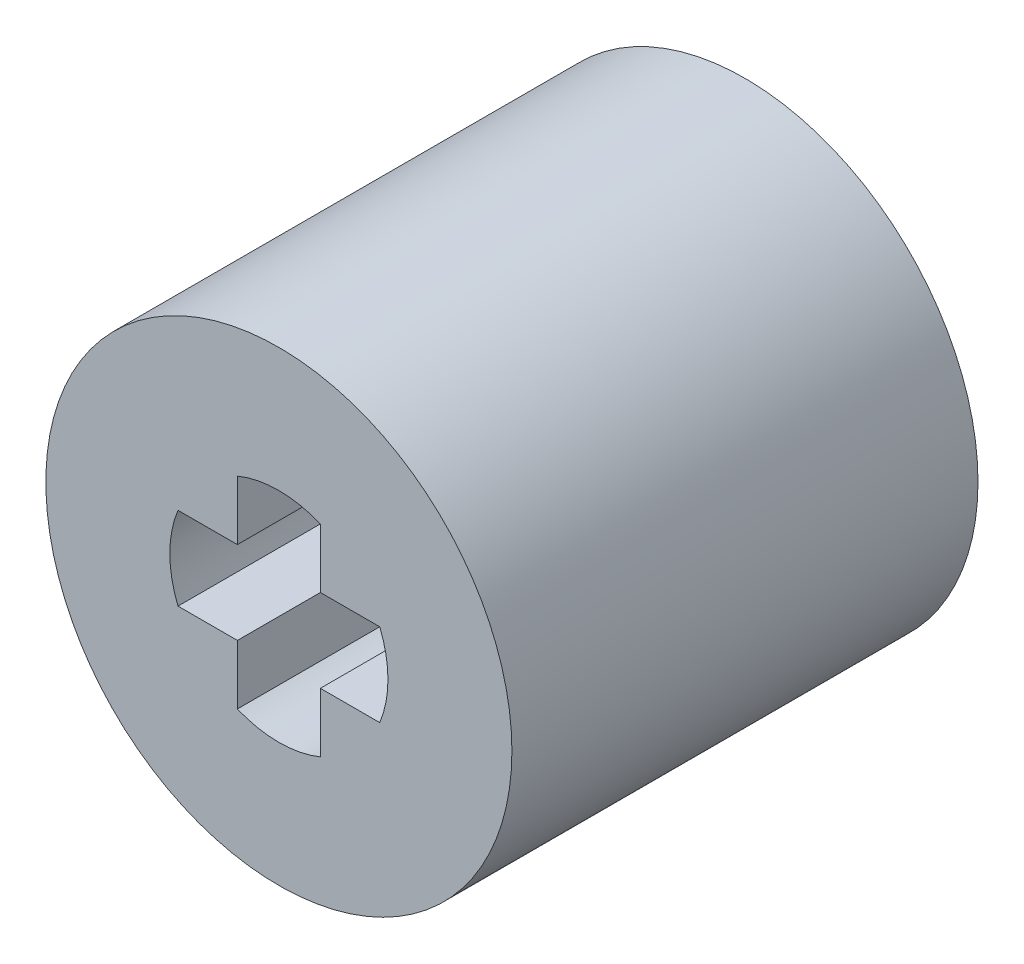
ISO-10303-21;
HEADER;
FILE_DESCRIPTION(('STEP AP214'),'2;1');
FILE_NAME('part.step','',(''),(''),'','','');
FILE_SCHEMA(('AUTOMOTIVE_DESIGN { 1 0 10303 214 1 1 1 1 }'));
ENDSEC;
DATA;
#1=APPLICATION_CONTEXT('core data for automotive mechanical design processes');
#2=APPLICATION_PROTOCOL_DEFINITION('international standard','automotive_design',2000,#1);
#3=PRODUCT_CONTEXT('',#1,'mechanical');
#4=PRODUCT('Part','Part','',(#3));
#5=PRODUCT_RELATED_PRODUCT_CATEGORY('part','',(#4));
#6=PRODUCT_DEFINITION_FORMATION('','',#4);
#7=PRODUCT_DEFINITION_CONTEXT('part definition',#1,'design');
#8=PRODUCT_DEFINITION('design','',#6,#7);
#9=PRODUCT_DEFINITION_SHAPE('','',#8);
#10=(LENGTH_UNIT() NAMED_UNIT(*) SI_UNIT(.MILLI.,.METRE.));
#11=(NAMED_UNIT(*) PLANE_ANGLE_UNIT() SI_UNIT($,.RADIAN.));
#12=(NAMED_UNIT(*) SI_UNIT($,.STERADIAN.) SOLID_ANGLE_UNIT());
#13=UNCERTAINTY_MEASURE_WITH_UNIT(LENGTH_MEASURE(1.E-05),#10,'distance_accuracy_value','');
#14=(GEOMETRIC_REPRESENTATION_CONTEXT(3) GLOBAL_UNCERTAINTY_ASSIGNED_CONTEXT((#13)) GLOBAL_UNIT_ASSIGNED_CONTEXT((#10,
#11,#12)) REPRESENTATION_CONTEXT('',''));
#15=CARTESIAN_POINT('',(0.,0.,0.));
#16=DIRECTION('',(0.,0.,1.));
#17=DIRECTION('',(1.,0.,0.));
#18=AXIS2_PLACEMENT_3D('',#15,#16,#17);
#19=CARTESIAN_POINT('',(0.,0.,0.));
#20=DIRECTION('',(0.,0.,1.));
#21=DIRECTION('',(1.,0.,0.));
#22=AXIS2_PLACEMENT_3D('',#19,#20,#21);
#23=PLANE('',#22);
#24=CARTESIAN_POINT('',(0.,0.,0.));
#25=DIRECTION('',(0.,0.,1.));
#26=DIRECTION('',(1.,0.,0.));
#27=AXIS2_PLACEMENT_3D('',#24,#25,#26);
#28=CIRCLE('',#27,1.5);
#29=CARTESIAN_POINT('',(-1.20743529847359,-0.89,0.));
#30=VERTEX_POINT('',#29);
#31=CARTESIAN_POINT('',(-0.889999999999999,-1.20743529847359,0.));
#32=VERTEX_POINT('',#31);
#33=EDGE_CURVE('E11',#30,#32,#28,.T.);
#34=ORIENTED_EDGE('',*,*,#33,.F.);
#35=DIRECTION('',(1.,0.,0.));
#36=VECTOR('',#35,1.);
#37=CARTESIAN_POINT('',(0.,-0.89,0.));
#38=LINE('',#37,#36);
#39=CARTESIAN_POINT('',(-0.89,-0.89,0.));
#40=VERTEX_POINT('',#39);
#41=EDGE_CURVE('E98',#30,#40,#38,.T.);
#42=ORIENTED_EDGE('',*,*,#41,.T.);
#43=DIRECTION('',(0.,-1.,0.));
#44=VECTOR('',#43,1.);
#45=CARTESIAN_POINT('',(-0.89,0.,0.));
#46=LINE('',#45,#44);
#47=EDGE_CURVE('E143',#40,#32,#46,.T.);
#48=ORIENTED_EDGE('',*,*,#47,.T.);
#49=EDGE_LOOP('',(#34,#42,#48));
#50=FACE_BOUND('',#49,.T.);
#51=ADVANCED_FACE('F47',(#50),#23,.F.);
#52=CARTESIAN_POINT('',(0.889999999999999,-1.20743529847359,0.));
#53=VERTEX_POINT('',#52);
#54=CARTESIAN_POINT('',(1.20743529847359,-0.89,0.));
#55=VERTEX_POINT('',#54);
#56=EDGE_CURVE('E57',#53,#55,#28,.T.);
#57=ORIENTED_EDGE('',*,*,#56,.F.);
#58=DIRECTION('',(0.,1.,0.));
#59=VECTOR('',#58,1.);
#60=CARTESIAN_POINT('',(0.89,0.,0.));
#61=LINE('',#60,#59);
#62=CARTESIAN_POINT('',(0.89,-0.89,0.));
#63=VERTEX_POINT('',#62);
#64=EDGE_CURVE('E205',#53,#63,#61,.T.);
#65=ORIENTED_EDGE('',*,*,#64,.T.);
#66=DIRECTION('',(1.,0.,0.));
#67=VECTOR('',#66,1.);
#68=CARTESIAN_POINT('',(0.,-0.89,0.));
#69=LINE('',#68,#67);
#70=EDGE_CURVE('E201',#63,#55,#69,.T.);
#71=ORIENTED_EDGE('',*,*,#70,.T.);
#72=EDGE_LOOP('',(#57,#65,#71));
#73=FACE_BOUND('',#72,.T.);
#74=ADVANCED_FACE('F313',(#73),#23,.F.);
#75=CARTESIAN_POINT('',(-1.11803398874989,1.,0.));
#76=VERTEX_POINT('',#75);
#77=CARTESIAN_POINT('',(-1.20743529847359,0.89,0.));
#78=VERTEX_POINT('',#77);
#79=EDGE_CURVE('E270',#76,#78,#28,.T.);
#80=ORIENTED_EDGE('',*,*,#79,.F.);
#81=DIRECTION('',(1.,0.,0.));
#82=VECTOR('',#81,1.);
#83=CARTESIAN_POINT('',(0.,1.,0.));
#84=LINE('',#83,#82);
#85=CARTESIAN_POINT('',(-0.89,1.,0.));
#86=VERTEX_POINT('',#85);
#87=EDGE_CURVE('E265',#76,#86,#84,.T.);
#88=ORIENTED_EDGE('',*,*,#87,.T.);
#89=DIRECTION('',(0.,-1.,0.));
#90=VECTOR('',#89,1.);
#91=CARTESIAN_POINT('',(-0.89,0.,0.));
#92=LINE('',#91,#90);
#93=CARTESIAN_POINT('',(-0.89,0.89,0.));
#94=VERTEX_POINT('',#93);
#95=EDGE_CURVE('E179',#86,#94,#92,.T.);
#96=ORIENTED_EDGE('',*,*,#95,.T.);
#97=DIRECTION('',(1.,0.,0.));
#98=VECTOR('',#97,1.);
#99=CARTESIAN_POINT('',(0.,0.89,0.));
#100=LINE('',#99,#98);
#101=EDGE_CURVE('E180',#78,#94,#100,.T.);
#102=ORIENTED_EDGE('',*,*,#101,.F.);
#103=EDGE_LOOP('',(#80,#88,#96,#102));
#104=FACE_BOUND('',#103,.T.);
#105=ADVANCED_FACE('F456',(#104),#23,.F.);
#106=CARTESIAN_POINT('',(1.20743529847359,0.89,0.));
#107=VERTEX_POINT('',#106);
#108=CARTESIAN_POINT('',(1.11803398874989,1.,0.));
#109=VERTEX_POINT('',#108);
#110=EDGE_CURVE('E263',#107,#109,#28,.T.);
#111=ORIENTED_EDGE('',*,*,#110,.F.);
#112=DIRECTION('',(1.,0.,0.));
#113=VECTOR('',#112,1.);
#114=CARTESIAN_POINT('',(0.,0.89,0.));
#115=LINE('',#114,#113);
#116=CARTESIAN_POINT('',(0.89,0.89,0.));
#117=VERTEX_POINT('',#116);
#118=EDGE_CURVE('E197',#117,#107,#115,.T.);
#119=ORIENTED_EDGE('',*,*,#118,.F.);
#120=DIRECTION('',(0.,1.,0.));
#121=VECTOR('',#120,1.);
#122=CARTESIAN_POINT('',(0.89,0.,0.));
#123=LINE('',#122,#121);
#124=CARTESIAN_POINT('',(0.89,1.,0.));
#125=VERTEX_POINT('',#124);
#126=EDGE_CURVE('E192',#117,#125,#123,.T.);
#127=ORIENTED_EDGE('',*,*,#126,.T.);
#128=EDGE_CURVE('E257',#125,#109,#84,.T.);
#129=ORIENTED_EDGE('',*,*,#128,.T.);
#130=EDGE_LOOP('',(#111,#119,#127,#129));
#131=FACE_BOUND('',#130,.T.);
#132=ADVANCED_FACE('F451',(#131),#23,.F.);
#133=CARTESIAN_POINT('',(0.,0.89,5.));
#134=DIRECTION('',(0.,1.,0.));
#135=DIRECTION('',(-1.,0.,0.));
#136=AXIS2_PLACEMENT_3D('',#133,#134,#135);
#137=PLANE('',#136);
#138=CARTESIAN_POINT('',(-2.16413955187737,0.89,0.));
#139=VERTEX_POINT('',#138);
#140=EDGE_CURVE('E175',#139,#78,#100,.T.);
#141=ORIENTED_EDGE('',*,*,#140,.T.);
#142=ORIENTED_EDGE('',*,*,#101,.T.);
#143=DIRECTION('',(0.,0.,-1.));
#144=VECTOR('',#143,1.);
#145=CARTESIAN_POINT('',(-0.89,0.89,5.));
#146=LINE('',#145,#144);
#147=CARTESIAN_POINT('',(-0.89,0.89,5.));
#148=VERTEX_POINT('',#147);
#149=EDGE_CURVE('E51',#148,#94,#146,.T.);
#150=ORIENTED_EDGE('',*,*,#149,.F.);
#151=DIRECTION('',(1.,0.,0.));
#152=VECTOR('',#151,1.);
#153=CARTESIAN_POINT('',(0.,0.89,5.));
#154=LINE('',#153,#152);
#155=CARTESIAN_POINT('',(-2.16413955187737,0.89,5.));
#156=VERTEX_POINT('',#155);
#157=EDGE_CURVE('E106',#156,#148,#154,.T.);
#158=ORIENTED_EDGE('',*,*,#157,.F.);
#159=DIRECTION('',(0.,0.,-1.));
#160=VECTOR('',#159,1.);
#161=CARTESIAN_POINT('',(-2.16413955187737,0.89,5.));
#162=LINE('',#161,#160);
#163=EDGE_CURVE('E75',#156,#139,#162,.T.);
#164=ORIENTED_EDGE('',*,*,#163,.T.);
#165=EDGE_LOOP('',(#141,#142,#150,#158,#164));
#166=FACE_BOUND('',#165,.T.);
#167=ADVANCED_FACE('F49',(#166),#137,.F.);
#168=CARTESIAN_POINT('',(-0.89,0.,5.));
#169=DIRECTION('',(1.,0.,0.));
#170=DIRECTION('',(0.,1.,0.));
#171=AXIS2_PLACEMENT_3D('',#168,#169,#170);
#172=PLANE('',#171);
#173=CARTESIAN_POINT('',(-0.89,2.16413955187737,0.));
#174=VERTEX_POINT('',#173);
#175=EDGE_CURVE('E181',#174,#86,#92,.T.);
#176=ORIENTED_EDGE('',*,*,#175,.F.);
#177=DIRECTION('',(0.,0.,-1.));
#178=VECTOR('',#177,1.);
#179=CARTESIAN_POINT('',(-0.89,2.16413955187737,5.));
#180=LINE('',#179,#178);
#181=CARTESIAN_POINT('',(-0.89,2.16413955187737,5.));
#182=VERTEX_POINT('',#181);
#183=EDGE_CURVE('E247',#182,#174,#180,.T.);
#184=ORIENTED_EDGE('',*,*,#183,.F.);
#185=DIRECTION('',(0.,-1.,0.));
#186=VECTOR('',#185,1.);
#187=CARTESIAN_POINT('',(-0.89,0.,5.));
#188=LINE('',#187,#186);
#189=EDGE_CURVE('E391',#182,#148,#188,.T.);
#190=ORIENTED_EDGE('',*,*,#189,.T.);
#191=ORIENTED_EDGE('',*,*,#149,.T.);
#192=ORIENTED_EDGE('',*,*,#95,.F.);
#193=EDGE_LOOP('',(#176,#184,#190,#191,#192));
#194=FACE_BOUND('',#193,.T.);
#195=ADVANCED_FACE('F418',(#194),#172,.T.);
#196=CARTESIAN_POINT('',(0.,0.,5.));
#197=DIRECTION('',(0.,0.,-1.));
#198=DIRECTION('',(-1.,0.,0.));
#199=AXIS2_PLACEMENT_3D('',#196,#197,#198);
#200=CYLINDRICAL_SURFACE('',#199,2.34);
#201=CARTESIAN_POINT('',(0.,0.,0.));
#202=DIRECTION('',(0.,0.,1.));
#203=DIRECTION('',(1.,0.,0.));
#204=AXIS2_PLACEMENT_3D('',#201,#202,#203);
#205=CIRCLE('',#204,2.34);
#206=CARTESIAN_POINT('',(0.89,2.16413955187737,0.));
#207=VERTEX_POINT('',#206);
#208=EDGE_CURVE('E185',#207,#174,#205,.T.);
#209=ORIENTED_EDGE('',*,*,#208,.F.);
#210=DIRECTION('',(0.,0.,-1.));
#211=VECTOR('',#210,1.);
#212=CARTESIAN_POINT('',(0.89,2.16413955187737,5.));
#213=LINE('',#212,#211);
#214=CARTESIAN_POINT('',(0.89,2.16413955187737,5.));
#215=VERTEX_POINT('',#214);
#216=EDGE_CURVE('E244',#215,#207,#213,.T.);
#217=ORIENTED_EDGE('',*,*,#216,.F.);
#218=CARTESIAN_POINT('',(0.,0.,5.));
#219=DIRECTION('',(0.,0.,1.));
#220=DIRECTION('',(1.,0.,0.));
#221=AXIS2_PLACEMENT_3D('',#218,#219,#220);
#222=CIRCLE('',#221,2.34);
#223=EDGE_CURVE('E169',#215,#182,#222,.T.);
#224=ORIENTED_EDGE('',*,*,#223,.T.);
#225=ORIENTED_EDGE('',*,*,#183,.T.);
#226=EDGE_LOOP('',(#209,#217,#224,#225));
#227=FACE_BOUND('',#226,.T.);
#228=ADVANCED_FACE('F421',(#227),#200,.F.);
#229=CARTESIAN_POINT('',(0.89,0.,5.));
#230=DIRECTION('',(-1.,0.,0.));
#231=DIRECTION('',(0.,-1.,0.));
#232=AXIS2_PLACEMENT_3D('',#229,#230,#231);
#233=PLANE('',#232);
#234=ORIENTED_EDGE('',*,*,#126,.F.);
#235=DIRECTION('',(0.,0.,-1.));
#236=VECTOR('',#235,1.);
#237=CARTESIAN_POINT('',(0.89,0.89,5.));
#238=LINE('',#237,#236);
#239=CARTESIAN_POINT('',(0.89,0.89,5.));
#240=VERTEX_POINT('',#239);
#241=EDGE_CURVE('E241',#240,#117,#238,.T.);
#242=ORIENTED_EDGE('',*,*,#241,.F.);
#243=DIRECTION('',(0.,1.,0.));
#244=VECTOR('',#243,1.);
#245=CARTESIAN_POINT('',(0.89,0.,5.));
#246=LINE('',#245,#244);
#247=EDGE_CURVE('E412',#240,#215,#246,.T.);
#248=ORIENTED_EDGE('',*,*,#247,.T.);
#249=ORIENTED_EDGE('',*,*,#216,.T.);
#250=EDGE_CURVE('E189',#125,#207,#123,.T.);
#251=ORIENTED_EDGE('',*,*,#250,.F.);
#252=EDGE_LOOP('',(#234,#242,#248,#249,#251));
#253=FACE_BOUND('',#252,.T.);
#254=ADVANCED_FACE('F424',(#253),#233,.T.);
#255=CARTESIAN_POINT('',(0.,0.89,5.));
#256=DIRECTION('',(0.,1.,0.));
#257=DIRECTION('',(-1.,0.,0.));
#258=AXIS2_PLACEMENT_3D('',#255,#256,#257);
#259=PLANE('',#258);
#260=ORIENTED_EDGE('',*,*,#118,.T.);
#261=CARTESIAN_POINT('',(2.16413955187737,0.89,0.));
#262=VERTEX_POINT('',#261);
#263=EDGE_CURVE('E196',#107,#262,#115,.T.);
#264=ORIENTED_EDGE('',*,*,#263,.T.);
#265=DIRECTION('',(0.,0.,-1.));
#266=VECTOR('',#265,1.);
#267=CARTESIAN_POINT('',(2.16413955187737,0.89,5.));
#268=LINE('',#267,#266);
#269=CARTESIAN_POINT('',(2.16413955187737,0.89,5.));
#270=VERTEX_POINT('',#269);
#271=EDGE_CURVE('E237',#270,#262,#268,.T.);
#272=ORIENTED_EDGE('',*,*,#271,.F.);
#273=DIRECTION('',(1.,0.,0.));
#274=VECTOR('',#273,1.);
#275=CARTESIAN_POINT('',(0.,0.89,5.));
#276=LINE('',#275,#274);
#277=EDGE_CURVE('E409',#240,#270,#276,.T.);
#278=ORIENTED_EDGE('',*,*,#277,.F.);
#279=ORIENTED_EDGE('',*,*,#241,.T.);
#280=EDGE_LOOP('',(#260,#264,#272,#278,#279));
#281=FACE_BOUND('',#280,.T.);
#282=ADVANCED_FACE('F429',(#281),#259,.F.);
#283=CARTESIAN_POINT('',(2.16413955187737,-0.89,0.));
#284=VERTEX_POINT('',#283);
#285=EDGE_CURVE('E191',#284,#262,#205,.T.);
#286=ORIENTED_EDGE('',*,*,#285,.F.);
#287=DIRECTION('',(0.,0.,-1.));
#288=VECTOR('',#287,1.);
#289=CARTESIAN_POINT('',(2.16413955187737,-0.89,5.));
#290=LINE('',#289,#288);
#291=CARTESIAN_POINT('',(2.16413955187737,-0.89,5.));
#292=VERTEX_POINT('',#291);
#293=EDGE_CURVE('E233',#292,#284,#290,.T.);
#294=ORIENTED_EDGE('',*,*,#293,.F.);
#295=EDGE_CURVE('E406',#292,#270,#222,.T.);
#296=ORIENTED_EDGE('',*,*,#295,.T.);
#297=ORIENTED_EDGE('',*,*,#271,.T.);
#298=EDGE_LOOP('',(#286,#294,#296,#297));
#299=FACE_BOUND('',#298,.T.);
#300=ADVANCED_FACE('F432',(#299),#200,.F.);
#301=CARTESIAN_POINT('',(0.,-0.89,5.));
#302=DIRECTION('',(0.,1.,0.));
#303=DIRECTION('',(-1.,0.,0.));
#304=AXIS2_PLACEMENT_3D('',#301,#302,#303);
#305=PLANE('',#304);
#306=ORIENTED_EDGE('',*,*,#70,.F.);
#307=DIRECTION('',(0.,0.,-1.));
#308=VECTOR('',#307,1.);
#309=CARTESIAN_POINT('',(0.89,-0.89,5.));
#310=LINE('',#309,#308);
#311=CARTESIAN_POINT('',(0.89,-0.89,5.));
#312=VERTEX_POINT('',#311);
#313=EDGE_CURVE('E229',#312,#63,#310,.T.);
#314=ORIENTED_EDGE('',*,*,#313,.F.);
#315=DIRECTION('',(1.,0.,0.));
#316=VECTOR('',#315,1.);
#317=CARTESIAN_POINT('',(0.,-0.89,5.));
#318=LINE('',#317,#316);
#319=EDGE_CURVE('E402',#312,#292,#318,.T.);
#320=ORIENTED_EDGE('',*,*,#319,.T.);
#321=ORIENTED_EDGE('',*,*,#293,.T.);
#322=EDGE_CURVE('E206',#55,#284,#69,.T.);
#323=ORIENTED_EDGE('',*,*,#322,.F.);
#324=EDGE_LOOP('',(#306,#314,#320,#321,#323));
#325=FACE_BOUND('',#324,.T.);
#326=ADVANCED_FACE('F435',(#325),#305,.T.);
#327=CARTESIAN_POINT('',(0.89,0.,5.));
#328=DIRECTION('',(-1.,0.,0.));
#329=DIRECTION('',(0.,-1.,0.));
#330=AXIS2_PLACEMENT_3D('',#327,#328,#329);
#331=PLANE('',#330);
#332=CARTESIAN_POINT('',(0.889999999999999,-2.16413955187737,0.));
#333=VERTEX_POINT('',#332);
#334=EDGE_CURVE('E207',#333,#53,#61,.T.);
#335=ORIENTED_EDGE('',*,*,#334,.F.);
#336=DIRECTION('',(0.,0.,-1.));
#337=VECTOR('',#336,1.);
#338=CARTESIAN_POINT('',(0.889999999999999,-2.16413955187737,5.));
#339=LINE('',#338,#337);
#340=CARTESIAN_POINT('',(0.889999999999999,-2.16413955187737,5.));
#341=VERTEX_POINT('',#340);
#342=EDGE_CURVE('E225',#341,#333,#339,.T.);
#343=ORIENTED_EDGE('',*,*,#342,.F.);
#344=DIRECTION('',(0.,1.,0.));
#345=VECTOR('',#344,1.);
#346=CARTESIAN_POINT('',(0.89,0.,5.));
#347=LINE('',#346,#345);
#348=EDGE_CURVE('E398',#341,#312,#347,.T.);
#349=ORIENTED_EDGE('',*,*,#348,.T.);
#350=ORIENTED_EDGE('',*,*,#313,.T.);
#351=ORIENTED_EDGE('',*,*,#64,.F.);
#352=EDGE_LOOP('',(#335,#343,#349,#350,#351));
#353=FACE_BOUND('',#352,.T.);
#354=ADVANCED_FACE('F318',(#353),#331,.T.);
#355=CARTESIAN_POINT('',(-0.889999999999999,-2.16413955187737,0.));
#356=VERTEX_POINT('',#355);
#357=EDGE_CURVE('E211',#356,#333,#205,.T.);
#358=ORIENTED_EDGE('',*,*,#357,.F.);
#359=DIRECTION('',(0.,0.,-1.));
#360=VECTOR('',#359,1.);
#361=CARTESIAN_POINT('',(-0.889999999999999,-2.16413955187737,5.));
#362=LINE('',#361,#360);
#363=CARTESIAN_POINT('',(-0.889999999999999,-2.16413955187737,5.));
#364=VERTEX_POINT('',#363);
#365=EDGE_CURVE('E147',#364,#356,#362,.T.);
#366=ORIENTED_EDGE('',*,*,#365,.F.);
#367=EDGE_CURVE('E157',#364,#341,#222,.T.);
#368=ORIENTED_EDGE('',*,*,#367,.T.);
#369=ORIENTED_EDGE('',*,*,#342,.T.);
#370=EDGE_LOOP('',(#358,#366,#368,#369));
#371=FACE_BOUND('',#370,.T.);
#372=ADVANCED_FACE('F397',(#371),#200,.F.);
#373=CARTESIAN_POINT('',(-0.89,0.,5.));
#374=DIRECTION('',(1.,0.,0.));
#375=DIRECTION('',(0.,1.,0.));
#376=AXIS2_PLACEMENT_3D('',#373,#374,#375);
#377=PLANE('',#376);
#378=ORIENTED_EDGE('',*,*,#47,.F.);
#379=DIRECTION('',(0.,0.,-1.));
#380=VECTOR('',#379,1.);
#381=CARTESIAN_POINT('',(-0.89,-0.89,5.));
#382=LINE('',#381,#380);
#383=CARTESIAN_POINT('',(-0.89,-0.89,5.));
#384=VERTEX_POINT('',#383);
#385=EDGE_CURVE('E137',#384,#40,#382,.T.);
#386=ORIENTED_EDGE('',*,*,#385,.F.);
#387=DIRECTION('',(0.,-1.,0.));
#388=VECTOR('',#387,1.);
#389=CARTESIAN_POINT('',(-0.89,0.,5.));
#390=LINE('',#389,#388);
#391=EDGE_CURVE('E141',#384,#364,#390,.T.);
#392=ORIENTED_EDGE('',*,*,#391,.T.);
#393=ORIENTED_EDGE('',*,*,#365,.T.);
#394=EDGE_CURVE('E214',#32,#356,#46,.T.);
#395=ORIENTED_EDGE('',*,*,#394,.F.);
#396=EDGE_LOOP('',(#378,#386,#392,#393,#395));
#397=FACE_BOUND('',#396,.T.);
#398=ADVANCED_FACE('F139',(#397),#377,.T.);
#399=CARTESIAN_POINT('',(0.,-0.89,5.));
#400=DIRECTION('',(0.,1.,0.));
#401=DIRECTION('',(-1.,0.,0.));
#402=AXIS2_PLACEMENT_3D('',#399,#400,#401);
#403=PLANE('',#402);
#404=CARTESIAN_POINT('',(-2.16413955187737,-0.89,0.));
#405=VERTEX_POINT('',#404);
#406=EDGE_CURVE('E215',#405,#30,#38,.T.);
#407=ORIENTED_EDGE('',*,*,#406,.F.);
#408=DIRECTION('',(0.,0.,-1.));
#409=VECTOR('',#408,1.);
#410=CARTESIAN_POINT('',(-2.16413955187737,-0.89,5.));
#411=LINE('',#410,#409);
#412=CARTESIAN_POINT('',(-2.16413955187737,-0.89,5.));
#413=VERTEX_POINT('',#412);
#414=EDGE_CURVE('E148',#413,#405,#411,.T.);
#415=ORIENTED_EDGE('',*,*,#414,.F.);
#416=DIRECTION('',(1.,0.,0.));
#417=VECTOR('',#416,1.);
#418=CARTESIAN_POINT('',(0.,-0.89,5.));
#419=LINE('',#418,#417);
#420=EDGE_CURVE('E154',#413,#384,#419,.T.);
#421=ORIENTED_EDGE('',*,*,#420,.T.);
#422=ORIENTED_EDGE('',*,*,#385,.T.);
#423=ORIENTED_EDGE('',*,*,#41,.F.);
#424=EDGE_LOOP('',(#407,#415,#421,#422,#423));
#425=FACE_BOUND('',#424,.T.);
#426=ADVANCED_FACE('F161',(#425),#403,.T.);
#427=EDGE_CURVE('E190',#139,#405,#205,.T.);
#428=ORIENTED_EDGE('',*,*,#427,.F.);
#429=ORIENTED_EDGE('',*,*,#163,.F.);
#430=EDGE_CURVE('E164',#156,#413,#222,.T.);
#431=ORIENTED_EDGE('',*,*,#430,.T.);
#432=ORIENTED_EDGE('',*,*,#414,.T.);
#433=EDGE_LOOP('',(#428,#429,#431,#432));
#434=FACE_BOUND('',#433,.T.);
#435=ADVANCED_FACE('F388',(#434),#200,.F.);
#436=CARTESIAN_POINT('',(0.,0.,5.));
#437=DIRECTION('',(0.,0.,-1.));
#438=DIRECTION('',(-1.,0.,0.));
#439=AXIS2_PLACEMENT_3D('',#436,#437,#438);
#440=CYLINDRICAL_SURFACE('',#439,5.);
#441=CARTESIAN_POINT('',(0.,0.,5.));
#442=DIRECTION('',(0.,0.,1.));
#443=DIRECTION('',(1.,0.,0.));
#444=AXIS2_PLACEMENT_3D('',#441,#442,#443);
#445=CIRCLE('',#444,5.);
#446=CARTESIAN_POINT('',(5.,0.,5.));
#447=VERTEX_POINT('',#446);
#448=EDGE_CURVE('E167',#447,#447,#445,.T.);
#449=ORIENTED_EDGE('',*,*,#448,.F.);
#450=EDGE_LOOP('',(#449));
#451=FACE_BOUND('',#450,.T.);
#452=CARTESIAN_POINT('',(0.,0.,-5.));
#453=DIRECTION('',(0.,0.,1.));
#454=DIRECTION('',(1.,0.,0.));
#455=AXIS2_PLACEMENT_3D('',#452,#453,#454);
#456=CIRCLE('',#455,5.);
#457=CARTESIAN_POINT('',(5.,0.,-5.));
#458=VERTEX_POINT('',#457);
#459=EDGE_CURVE('E337',#458,#458,#456,.T.);
#460=ORIENTED_EDGE('',*,*,#459,.T.);
#461=EDGE_LOOP('',(#460));
#462=FACE_BOUND('',#461,.T.);
#463=ADVANCED_FACE('F591',(#451,#462),#440,.T.);
#464=CARTESIAN_POINT('',(0.,0.,5.));
#465=DIRECTION('',(0.,0.,1.));
#466=DIRECTION('',(1.,0.,0.));
#467=AXIS2_PLACEMENT_3D('',#464,#465,#466);
#468=PLANE('',#467);
#469=ORIENTED_EDGE('',*,*,#157,.T.);
#470=ORIENTED_EDGE('',*,*,#189,.F.);
#471=ORIENTED_EDGE('',*,*,#223,.F.);
#472=ORIENTED_EDGE('',*,*,#247,.F.);
#473=ORIENTED_EDGE('',*,*,#277,.T.);
#474=ORIENTED_EDGE('',*,*,#295,.F.);
#475=ORIENTED_EDGE('',*,*,#319,.F.);
#476=ORIENTED_EDGE('',*,*,#348,.F.);
#477=ORIENTED_EDGE('',*,*,#367,.F.);
#478=ORIENTED_EDGE('',*,*,#391,.F.);
#479=ORIENTED_EDGE('',*,*,#420,.F.);
#480=ORIENTED_EDGE('',*,*,#430,.F.);
#481=EDGE_LOOP('',(#469,#470,#471,#472,#473,#474,#475,#476,#477,#478,#479,#480));
#482=FACE_BOUND('',#481,.T.);
#483=ORIENTED_EDGE('',*,*,#448,.T.);
#484=EDGE_LOOP('',(#483));
#485=FACE_BOUND('',#484,.T.);
#486=ADVANCED_FACE('F152',(#482,#485),#468,.T.);
#487=CARTESIAN_POINT('',(0.,0.,0.));
#488=DIRECTION('',(0.,0.,1.));
#489=DIRECTION('',(1.,0.,0.));
#490=AXIS2_PLACEMENT_3D('',#487,#488,#489);
#491=PLANE('',#490);
#492=ORIENTED_EDGE('',*,*,#140,.F.);
#493=ORIENTED_EDGE('',*,*,#427,.T.);
#494=ORIENTED_EDGE('',*,*,#406,.T.);
#495=EDGE_CURVE('E59',#78,#30,#28,.T.);
#496=ORIENTED_EDGE('',*,*,#495,.F.);
#497=EDGE_LOOP('',(#492,#493,#494,#496));
#498=FACE_BOUND('',#497,.T.);
#499=ADVANCED_FACE('F386',(#498),#491,.T.);
#500=EDGE_CURVE('E292',#32,#53,#28,.T.);
#501=ORIENTED_EDGE('',*,*,#500,.F.);
#502=ORIENTED_EDGE('',*,*,#394,.T.);
#503=ORIENTED_EDGE('',*,*,#357,.T.);
#504=ORIENTED_EDGE('',*,*,#334,.T.);
#505=EDGE_LOOP('',(#501,#502,#503,#504));
#506=FACE_BOUND('',#505,.T.);
#507=ADVANCED_FACE('F395',(#506),#491,.T.);
#508=EDGE_CURVE('E284',#55,#107,#28,.T.);
#509=ORIENTED_EDGE('',*,*,#508,.F.);
#510=ORIENTED_EDGE('',*,*,#322,.T.);
#511=ORIENTED_EDGE('',*,*,#285,.T.);
#512=ORIENTED_EDGE('',*,*,#263,.F.);
#513=EDGE_LOOP('',(#509,#510,#511,#512));
#514=FACE_BOUND('',#513,.T.);
#515=ADVANCED_FACE('F437',(#514),#491,.T.);
#516=CARTESIAN_POINT('',(0.,0.,-5.));
#517=DIRECTION('',(0.,0.,1.));
#518=DIRECTION('',(1.,0.,0.));
#519=AXIS2_PLACEMENT_3D('',#516,#517,#518);
#520=CYLINDRICAL_SURFACE('',#519,1.5);
#521=ORIENTED_EDGE('',*,*,#79,.T.);
#522=ORIENTED_EDGE('',*,*,#495,.T.);
#523=ORIENTED_EDGE('',*,*,#33,.T.);
#524=ORIENTED_EDGE('',*,*,#500,.T.);
#525=ORIENTED_EDGE('',*,*,#56,.T.);
#526=ORIENTED_EDGE('',*,*,#508,.T.);
#527=ORIENTED_EDGE('',*,*,#110,.T.);
#528=DIRECTION('',(0.,0.,1.));
#529=VECTOR('',#528,1.);
#530=CARTESIAN_POINT('',(1.11803398874989,1.,-5.));
#531=LINE('',#530,#529);
#532=CARTESIAN_POINT('',(1.11803398874989,1.,-5.));
#533=VERTEX_POINT('',#532);
#534=EDGE_CURVE('E66',#533,#109,#531,.T.);
#535=ORIENTED_EDGE('',*,*,#534,.F.);
#536=CARTESIAN_POINT('',(0.,0.,-5.));
#537=DIRECTION('',(0.,0.,1.));
#538=DIRECTION('',(1.,0.,0.));
#539=AXIS2_PLACEMENT_3D('',#536,#537,#538);
#540=CIRCLE('',#539,1.5);
#541=CARTESIAN_POINT('',(-1.11803398874989,1.,-5.));
#542=VERTEX_POINT('',#541);
#543=EDGE_CURVE('E274',#542,#533,#540,.T.);
#544=ORIENTED_EDGE('',*,*,#543,.F.);
#545=DIRECTION('',(0.,0.,1.));
#546=VECTOR('',#545,1.);
#547=CARTESIAN_POINT('',(-1.11803398874989,1.,-5.));
#548=LINE('',#547,#546);
#549=EDGE_CURVE('E335',#542,#76,#548,.T.);
#550=ORIENTED_EDGE('',*,*,#549,.T.);
#551=EDGE_LOOP('',(#521,#522,#523,#524,#525,#526,#527,#535,#544,#550));
#552=FACE_BOUND('',#551,.T.);
#553=ADVANCED_FACE('F304',(#552),#520,.F.);
#554=CARTESIAN_POINT('',(0.,1.,-5.));
#555=DIRECTION('',(0.,-1.,0.));
#556=DIRECTION('',(0.,0.,-1.));
#557=AXIS2_PLACEMENT_3D('',#554,#555,#556);
#558=PLANE('',#557);
#559=ORIENTED_EDGE('',*,*,#87,.F.);
#560=ORIENTED_EDGE('',*,*,#549,.F.);
#561=DIRECTION('',(1.,0.,0.));
#562=VECTOR('',#561,1.);
#563=CARTESIAN_POINT('',(0.,1.,-5.));
#564=LINE('',#563,#562);
#565=EDGE_CURVE('E341',#542,#533,#564,.T.);
#566=ORIENTED_EDGE('',*,*,#565,.T.);
#567=ORIENTED_EDGE('',*,*,#534,.T.);
#568=ORIENTED_EDGE('',*,*,#128,.F.);
#569=EDGE_CURVE('E266',#86,#125,#84,.T.);
#570=ORIENTED_EDGE('',*,*,#569,.F.);
#571=EDGE_LOOP('',(#559,#560,#566,#567,#568,#570));
#572=FACE_BOUND('',#571,.T.);
#573=ADVANCED_FACE('F356',(#572),#558,.T.);
#574=CARTESIAN_POINT('',(0.,0.,-5.));
#575=DIRECTION('',(0.,0.,1.));
#576=DIRECTION('',(1.,0.,0.));
#577=AXIS2_PLACEMENT_3D('',#574,#575,#576);
#578=PLANE('',#577);
#579=ORIENTED_EDGE('',*,*,#543,.T.);
#580=ORIENTED_EDGE('',*,*,#565,.F.);
#581=EDGE_LOOP('',(#579,#580));
#582=FACE_BOUND('',#581,.T.);
#583=ORIENTED_EDGE('',*,*,#459,.F.);
#584=EDGE_LOOP('',(#583));
#585=FACE_BOUND('',#584,.T.);
#586=ADVANCED_FACE('F350',(#582,#585),#578,.F.);
#587=ORIENTED_EDGE('',*,*,#569,.T.);
#588=ORIENTED_EDGE('',*,*,#250,.T.);
#589=ORIENTED_EDGE('',*,*,#208,.T.);
#590=ORIENTED_EDGE('',*,*,#175,.T.);
#591=EDGE_LOOP('',(#587,#588,#589,#590));
#592=FACE_BOUND('',#591,.T.);
#593=ADVANCED_FACE('F440',(#592),#491,.T.);
#594=CLOSED_SHELL('',(#51,#74,#105,#132,#167,#195,#228,#254,#282,#300,#326,#354,#372,#398,#426,
#435,#463,#486,#499,#507,#515,#553,#573,#586,#593));
#595=MANIFOLD_SOLID_BREP('B2',#594);
#596=ADVANCED_BREP_SHAPE_REPRESENTATION('',(#18,#595),#14);
#597=SHAPE_DEFINITION_REPRESENTATION(#9,#596);
ENDSEC;
END-ISO-10303-21;
